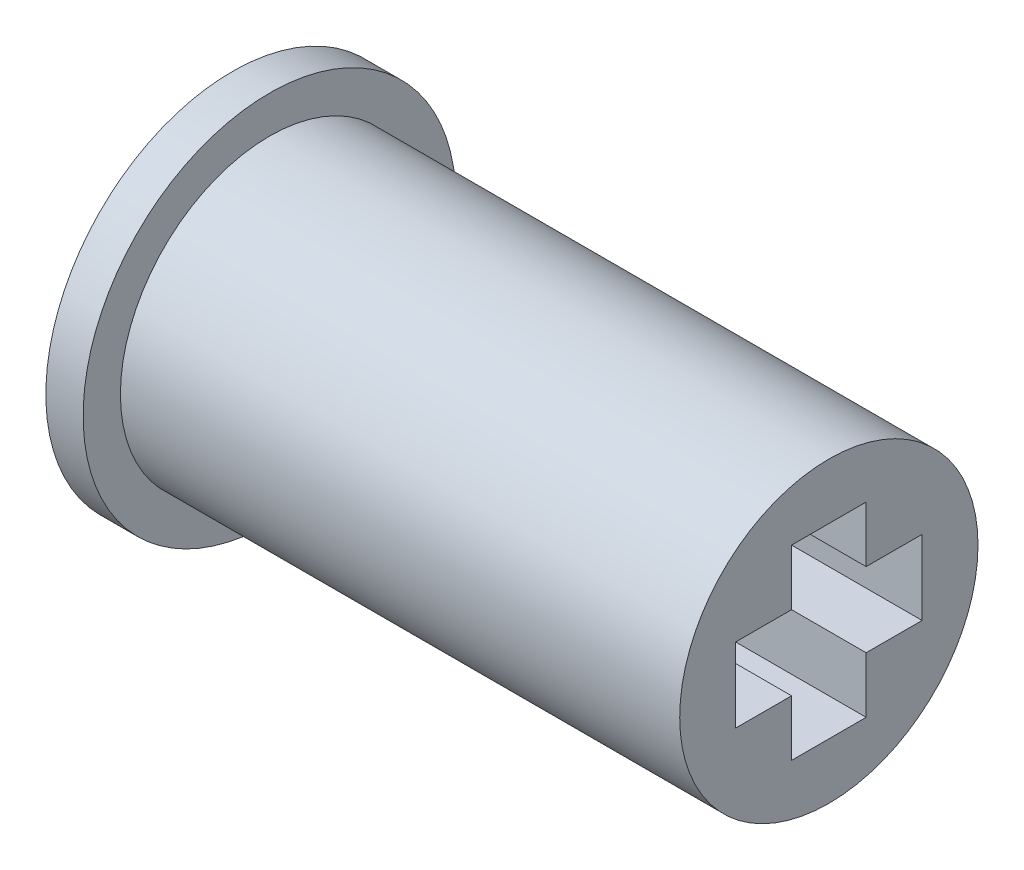
ISO-10303-21;
HEADER;
FILE_DESCRIPTION(('STEP AP214'),'2;1');
FILE_NAME('part.step','',(''),(''),'','','');
FILE_SCHEMA(('AUTOMOTIVE_DESIGN { 1 0 10303 214 1 1 1 1 }'));
ENDSEC;
DATA;
#1=APPLICATION_CONTEXT('core data for automotive mechanical design processes');
#2=APPLICATION_PROTOCOL_DEFINITION('international standard','automotive_design',2000,#1);
#3=PRODUCT_CONTEXT('',#1,'mechanical');
#4=PRODUCT('Part','Part','',(#3));
#5=PRODUCT_RELATED_PRODUCT_CATEGORY('part','',(#4));
#6=PRODUCT_DEFINITION_FORMATION('','',#4);
#7=PRODUCT_DEFINITION_CONTEXT('part definition',#1,'design');
#8=PRODUCT_DEFINITION('design','',#6,#7);
#9=PRODUCT_DEFINITION_SHAPE('','',#8);
#10=(LENGTH_UNIT() NAMED_UNIT(*) SI_UNIT(.MILLI.,.METRE.));
#11=(NAMED_UNIT(*) PLANE_ANGLE_UNIT() SI_UNIT($,.RADIAN.));
#12=(NAMED_UNIT(*) SI_UNIT($,.STERADIAN.) SOLID_ANGLE_UNIT());
#13=UNCERTAINTY_MEASURE_WITH_UNIT(LENGTH_MEASURE(1.E-05),#10,'distance_accuracy_value','');
#14=(GEOMETRIC_REPRESENTATION_CONTEXT(3) GLOBAL_UNCERTAINTY_ASSIGNED_CONTEXT((#13)) GLOBAL_UNIT_ASSIGNED_CONTEXT((#10,
#11,#12)) REPRESENTATION_CONTEXT('',''));
#15=CARTESIAN_POINT('',(0.,0.,0.));
#16=DIRECTION('',(0.,0.,1.));
#17=DIRECTION('',(1.,0.,0.));
#18=AXIS2_PLACEMENT_3D('',#15,#16,#17);
#19=CARTESIAN_POINT('',(16.,0.,0.));
#20=DIRECTION('',(1.,0.,0.));
#21=DIRECTION('',(0.,0.,-1.));
#22=AXIS2_PLACEMENT_3D('',#19,#20,#21);
#23=PLANE('',#22);
#24=CARTESIAN_POINT('',(16.,0.,0.));
#25=DIRECTION('',(1.,0.,0.));
#26=DIRECTION('',(0.,0.,-1.));
#27=AXIS2_PLACEMENT_3D('',#24,#25,#26);
#28=CIRCLE('',#27,4.);
#29=CARTESIAN_POINT('',(16.,0.,-4.));
#30=VERTEX_POINT('',#29);
#31=EDGE_CURVE('E190',#30,#30,#28,.T.);
#32=ORIENTED_EDGE('',*,*,#31,.T.);
#33=EDGE_LOOP('',(#32));
#34=FACE_BOUND('',#33,.T.);
#35=DIRECTION('',(0.,0.,1.));
#36=VECTOR('',#35,1.);
#37=CARTESIAN_POINT('',(16.,1.,0.));
#38=LINE('',#37,#36);
#39=CARTESIAN_POINT('',(16.,0.999999999999999,1.));
#40=VERTEX_POINT('',#39);
#41=CARTESIAN_POINT('',(16.,0.999999999999999,2.5));
#42=VERTEX_POINT('',#41);
#43=EDGE_CURVE('E159',#40,#42,#38,.T.);
#44=ORIENTED_EDGE('',*,*,#43,.F.);
#45=DIRECTION('',(0.,1.,0.));
#46=VECTOR('',#45,1.);
#47=CARTESIAN_POINT('',(16.,0.,1.));
#48=LINE('',#47,#46);
#49=CARTESIAN_POINT('',(16.,2.5,1.));
#50=VERTEX_POINT('',#49);
#51=EDGE_CURVE('E52',#40,#50,#48,.T.);
#52=ORIENTED_EDGE('',*,*,#51,.T.);
#53=DIRECTION('',(0.,0.,-1.));
#54=VECTOR('',#53,1.);
#55=CARTESIAN_POINT('',(16.,2.5,0.));
#56=LINE('',#55,#54);
#57=CARTESIAN_POINT('',(16.,2.5,-1.));
#58=VERTEX_POINT('',#57);
#59=EDGE_CURVE('E102',#50,#58,#56,.T.);
#60=ORIENTED_EDGE('',*,*,#59,.T.);
#61=DIRECTION('',(0.,1.,0.));
#62=VECTOR('',#61,1.);
#63=CARTESIAN_POINT('',(16.,0.,-1.));
#64=LINE('',#63,#62);
#65=CARTESIAN_POINT('',(16.,1.,-1.));
#66=VERTEX_POINT('',#65);
#67=EDGE_CURVE('E184',#66,#58,#64,.T.);
#68=ORIENTED_EDGE('',*,*,#67,.F.);
#69=DIRECTION('',(0.,0.,-1.));
#70=VECTOR('',#69,1.);
#71=CARTESIAN_POINT('',(16.,1.,0.));
#72=LINE('',#71,#70);
#73=CARTESIAN_POINT('',(16.,1.,-2.5));
#74=VERTEX_POINT('',#73);
#75=EDGE_CURVE('E138',#66,#74,#72,.T.);
#76=ORIENTED_EDGE('',*,*,#75,.T.);
#77=DIRECTION('',(0.,-1.,0.));
#78=VECTOR('',#77,1.);
#79=CARTESIAN_POINT('',(16.,0.,-2.5));
#80=LINE('',#79,#78);
#81=CARTESIAN_POINT('',(16.,-1.,-2.5));
#82=VERTEX_POINT('',#81);
#83=EDGE_CURVE('E180',#74,#82,#80,.T.);
#84=ORIENTED_EDGE('',*,*,#83,.T.);
#85=DIRECTION('',(0.,0.,-1.));
#86=VECTOR('',#85,1.);
#87=CARTESIAN_POINT('',(16.,-1.,0.));
#88=LINE('',#87,#86);
#89=CARTESIAN_POINT('',(16.,-1.,-1.));
#90=VERTEX_POINT('',#89);
#91=EDGE_CURVE('E177',#90,#82,#88,.T.);
#92=ORIENTED_EDGE('',*,*,#91,.F.);
#93=DIRECTION('',(0.,-1.,0.));
#94=VECTOR('',#93,1.);
#95=CARTESIAN_POINT('',(16.,0.,-1.));
#96=LINE('',#95,#94);
#97=CARTESIAN_POINT('',(16.,-2.5,-1.));
#98=VERTEX_POINT('',#97);
#99=EDGE_CURVE('E174',#90,#98,#96,.T.);
#100=ORIENTED_EDGE('',*,*,#99,.T.);
#101=DIRECTION('',(0.,0.,1.));
#102=VECTOR('',#101,1.);
#103=CARTESIAN_POINT('',(16.,-2.5,0.));
#104=LINE('',#103,#102);
#105=CARTESIAN_POINT('',(16.,-2.5,1.));
#106=VERTEX_POINT('',#105);
#107=EDGE_CURVE('E171',#98,#106,#104,.T.);
#108=ORIENTED_EDGE('',*,*,#107,.T.);
#109=DIRECTION('',(0.,-1.,0.));
#110=VECTOR('',#109,1.);
#111=CARTESIAN_POINT('',(16.,0.,1.));
#112=LINE('',#111,#110);
#113=CARTESIAN_POINT('',(16.,-1.,1.));
#114=VERTEX_POINT('',#113);
#115=EDGE_CURVE('E168',#114,#106,#112,.T.);
#116=ORIENTED_EDGE('',*,*,#115,.F.);
#117=DIRECTION('',(0.,0.,1.));
#118=VECTOR('',#117,1.);
#119=CARTESIAN_POINT('',(16.,-1.,0.));
#120=LINE('',#119,#118);
#121=CARTESIAN_POINT('',(16.,-1.,2.5));
#122=VERTEX_POINT('',#121);
#123=EDGE_CURVE('E165',#114,#122,#120,.T.);
#124=ORIENTED_EDGE('',*,*,#123,.T.);
#125=DIRECTION('',(0.,1.,0.));
#126=VECTOR('',#125,1.);
#127=CARTESIAN_POINT('',(16.,0.,2.5));
#128=LINE('',#127,#126);
#129=EDGE_CURVE('E162',#122,#42,#128,.T.);
#130=ORIENTED_EDGE('',*,*,#129,.T.);
#131=EDGE_LOOP('',(#44,#52,#60,#68,#76,#84,#92,#100,#108,#116,#124,#130));
#132=FACE_BOUND('',#131,.T.);
#133=ADVANCED_FACE('F35',(#34,#132),#23,.T.);
#134=CARTESIAN_POINT('',(1.,0.,0.));
#135=DIRECTION('',(-1.,0.,0.));
#136=DIRECTION('',(0.,0.,1.));
#137=AXIS2_PLACEMENT_3D('',#134,#135,#136);
#138=CYLINDRICAL_SURFACE('',#137,5.);
#139=CARTESIAN_POINT('',(1.,0.,0.));
#140=DIRECTION('',(1.,0.,0.));
#141=DIRECTION('',(0.,0.,-1.));
#142=AXIS2_PLACEMENT_3D('',#139,#140,#141);
#143=CIRCLE('',#142,5.);
#144=CARTESIAN_POINT('',(1.,0.,-5.));
#145=VERTEX_POINT('',#144);
#146=EDGE_CURVE('E44',#145,#145,#143,.T.);
#147=ORIENTED_EDGE('',*,*,#146,.F.);
#148=EDGE_LOOP('',(#147));
#149=FACE_BOUND('',#148,.T.);
#150=CARTESIAN_POINT('',(0.,0.,0.));
#151=DIRECTION('',(1.,0.,0.));
#152=DIRECTION('',(0.,0.,-1.));
#153=AXIS2_PLACEMENT_3D('',#150,#151,#152);
#154=CIRCLE('',#153,5.);
#155=CARTESIAN_POINT('',(0.,0.,-5.));
#156=VERTEX_POINT('',#155);
#157=EDGE_CURVE('E39',#156,#156,#154,.T.);
#158=ORIENTED_EDGE('',*,*,#157,.T.);
#159=EDGE_LOOP('',(#158));
#160=FACE_BOUND('',#159,.T.);
#161=ADVANCED_FACE('F37',(#149,#160),#138,.T.);
#162=CARTESIAN_POINT('',(1.,0.,0.));
#163=DIRECTION('',(1.,0.,0.));
#164=DIRECTION('',(0.,0.,-1.));
#165=AXIS2_PLACEMENT_3D('',#162,#163,#164);
#166=PLANE('',#165);
#167=CARTESIAN_POINT('',(1.,0.,0.));
#168=DIRECTION('',(1.,0.,0.));
#169=DIRECTION('',(0.,0.,-1.));
#170=AXIS2_PLACEMENT_3D('',#167,#168,#169);
#171=CIRCLE('',#170,4.);
#172=CARTESIAN_POINT('',(1.,0.,-4.));
#173=VERTEX_POINT('',#172);
#174=EDGE_CURVE('E11',#173,#173,#171,.T.);
#175=ORIENTED_EDGE('',*,*,#174,.F.);
#176=EDGE_LOOP('',(#175));
#177=FACE_BOUND('',#176,.T.);
#178=ORIENTED_EDGE('',*,*,#146,.T.);
#179=EDGE_LOOP('',(#178));
#180=FACE_BOUND('',#179,.T.);
#181=ADVANCED_FACE('F219',(#177,#180),#166,.T.);
#182=CARTESIAN_POINT('',(0.,0.,0.));
#183=DIRECTION('',(1.,0.,0.));
#184=DIRECTION('',(0.,0.,-1.));
#185=AXIS2_PLACEMENT_3D('',#182,#183,#184);
#186=PLANE('',#185);
#187=ORIENTED_EDGE('',*,*,#157,.F.);
#188=EDGE_LOOP('',(#187));
#189=FACE_BOUND('',#188,.T.);
#190=ADVANCED_FACE('F216',(#189),#186,.F.);
#191=CARTESIAN_POINT('',(16.,0.,0.));
#192=DIRECTION('',(-1.,0.,0.));
#193=DIRECTION('',(0.,0.,1.));
#194=AXIS2_PLACEMENT_3D('',#191,#192,#193);
#195=CYLINDRICAL_SURFACE('',#194,4.);
#196=ORIENTED_EDGE('',*,*,#31,.F.);
#197=EDGE_LOOP('',(#196));
#198=FACE_BOUND('',#197,.T.);
#199=ORIENTED_EDGE('',*,*,#174,.T.);
#200=EDGE_LOOP('',(#199));
#201=FACE_BOUND('',#200,.T.);
#202=ADVANCED_FACE('F218',(#198,#201),#195,.T.);
#203=CARTESIAN_POINT('',(1.,0.,1.));
#204=DIRECTION('',(0.,0.,-1.));
#205=DIRECTION('',(-1.,0.,0.));
#206=AXIS2_PLACEMENT_3D('',#203,#204,#205);
#207=PLANE('',#206);
#208=ORIENTED_EDGE('',*,*,#51,.F.);
#209=DIRECTION('',(1.,0.,0.));
#210=VECTOR('',#209,1.);
#211=CARTESIAN_POINT('',(1.,1.,1.));
#212=LINE('',#211,#210);
#213=CARTESIAN_POINT('',(1.,1.,1.));
#214=VERTEX_POINT('',#213);
#215=EDGE_CURVE('E105',#214,#40,#212,.T.);
#216=ORIENTED_EDGE('',*,*,#215,.F.);
#217=DIRECTION('',(0.,1.,0.));
#218=VECTOR('',#217,1.);
#219=CARTESIAN_POINT('',(1.,0.,1.));
#220=LINE('',#219,#218);
#221=CARTESIAN_POINT('',(1.,2.5,1.));
#222=VERTEX_POINT('',#221);
#223=EDGE_CURVE('E187',#214,#222,#220,.T.);
#224=ORIENTED_EDGE('',*,*,#223,.T.);
#225=DIRECTION('',(1.,0.,0.));
#226=VECTOR('',#225,1.);
#227=CARTESIAN_POINT('',(1.,2.5,1.));
#228=LINE('',#227,#226);
#229=EDGE_CURVE('E188',#222,#50,#228,.T.);
#230=ORIENTED_EDGE('',*,*,#229,.T.);
#231=EDGE_LOOP('',(#208,#216,#224,#230));
#232=FACE_BOUND('',#231,.T.);
#233=ADVANCED_FACE('F224',(#232),#207,.T.);
#234=CARTESIAN_POINT('',(1.,2.5,0.));
#235=DIRECTION('',(0.,-1.,0.));
#236=DIRECTION('',(0.,0.,-1.));
#237=AXIS2_PLACEMENT_3D('',#234,#235,#236);
#238=PLANE('',#237);
#239=ORIENTED_EDGE('',*,*,#59,.F.);
#240=ORIENTED_EDGE('',*,*,#229,.F.);
#241=DIRECTION('',(0.,0.,-1.));
#242=VECTOR('',#241,1.);
#243=CARTESIAN_POINT('',(1.,2.5,0.));
#244=LINE('',#243,#242);
#245=CARTESIAN_POINT('',(1.,2.5,-1.));
#246=VERTEX_POINT('',#245);
#247=EDGE_CURVE('E61',#222,#246,#244,.T.);
#248=ORIENTED_EDGE('',*,*,#247,.T.);
#249=DIRECTION('',(1.,0.,0.));
#250=VECTOR('',#249,1.);
#251=CARTESIAN_POINT('',(1.,2.5,-1.));
#252=LINE('',#251,#250);
#253=EDGE_CURVE('E143',#246,#58,#252,.T.);
#254=ORIENTED_EDGE('',*,*,#253,.T.);
#255=EDGE_LOOP('',(#239,#240,#248,#254));
#256=FACE_BOUND('',#255,.T.);
#257=ADVANCED_FACE('F240',(#256),#238,.T.);
#258=CARTESIAN_POINT('',(1.,0.,-1.));
#259=DIRECTION('',(0.,0.,-1.));
#260=DIRECTION('',(0.,1.,0.));
#261=AXIS2_PLACEMENT_3D('',#258,#259,#260);
#262=PLANE('',#261);
#263=ORIENTED_EDGE('',*,*,#67,.T.);
#264=ORIENTED_EDGE('',*,*,#253,.F.);
#265=DIRECTION('',(0.,1.,0.));
#266=VECTOR('',#265,1.);
#267=CARTESIAN_POINT('',(1.,0.,-1.));
#268=LINE('',#267,#266);
#269=CARTESIAN_POINT('',(1.,1.,-1.));
#270=VERTEX_POINT('',#269);
#271=EDGE_CURVE('E148',#270,#246,#268,.T.);
#272=ORIENTED_EDGE('',*,*,#271,.F.);
#273=DIRECTION('',(1.,0.,0.));
#274=VECTOR('',#273,1.);
#275=CARTESIAN_POINT('',(1.,1.,-1.));
#276=LINE('',#275,#274);
#277=EDGE_CURVE('E132',#270,#66,#276,.T.);
#278=ORIENTED_EDGE('',*,*,#277,.T.);
#279=EDGE_LOOP('',(#263,#264,#272,#278));
#280=FACE_BOUND('',#279,.T.);
#281=ADVANCED_FACE('F153',(#280),#262,.F.);
#282=CARTESIAN_POINT('',(1.,1.,0.));
#283=DIRECTION('',(0.,-1.,0.));
#284=DIRECTION('',(0.,0.,-1.));
#285=AXIS2_PLACEMENT_3D('',#282,#283,#284);
#286=PLANE('',#285);
#287=ORIENTED_EDGE('',*,*,#75,.F.);
#288=ORIENTED_EDGE('',*,*,#277,.F.);
#289=DIRECTION('',(0.,0.,-1.));
#290=VECTOR('',#289,1.);
#291=CARTESIAN_POINT('',(1.,1.,0.));
#292=LINE('',#291,#290);
#293=CARTESIAN_POINT('',(1.,1.,-2.5));
#294=VERTEX_POINT('',#293);
#295=EDGE_CURVE('E135',#270,#294,#292,.T.);
#296=ORIENTED_EDGE('',*,*,#295,.T.);
#297=DIRECTION('',(1.,0.,0.));
#298=VECTOR('',#297,1.);
#299=CARTESIAN_POINT('',(1.,1.,-2.5));
#300=LINE('',#299,#298);
#301=EDGE_CURVE('E144',#294,#74,#300,.T.);
#302=ORIENTED_EDGE('',*,*,#301,.T.);
#303=EDGE_LOOP('',(#287,#288,#296,#302));
#304=FACE_BOUND('',#303,.T.);
#305=ADVANCED_FACE('F134',(#304),#286,.T.);
#306=CARTESIAN_POINT('',(1.,0.,-2.5));
#307=DIRECTION('',(0.,0.,1.));
#308=DIRECTION('',(0.,-1.,0.));
#309=AXIS2_PLACEMENT_3D('',#306,#307,#308);
#310=PLANE('',#309);
#311=ORIENTED_EDGE('',*,*,#83,.F.);
#312=ORIENTED_EDGE('',*,*,#301,.F.);
#313=DIRECTION('',(0.,-1.,0.));
#314=VECTOR('',#313,1.);
#315=CARTESIAN_POINT('',(1.,0.,-2.5));
#316=LINE('',#315,#314);
#317=CARTESIAN_POINT('',(1.,-1.,-2.5));
#318=VERTEX_POINT('',#317);
#319=EDGE_CURVE('E150',#294,#318,#316,.T.);
#320=ORIENTED_EDGE('',*,*,#319,.T.);
#321=DIRECTION('',(1.,0.,0.));
#322=VECTOR('',#321,1.);
#323=CARTESIAN_POINT('',(1.,-1.,-2.5));
#324=LINE('',#323,#322);
#325=EDGE_CURVE('E193',#318,#82,#324,.T.);
#326=ORIENTED_EDGE('',*,*,#325,.T.);
#327=EDGE_LOOP('',(#311,#312,#320,#326));
#328=FACE_BOUND('',#327,.T.);
#329=ADVANCED_FACE('F268',(#328),#310,.T.);
#330=CARTESIAN_POINT('',(1.,-1.,0.));
#331=DIRECTION('',(0.,-1.,0.));
#332=DIRECTION('',(0.,0.,-1.));
#333=AXIS2_PLACEMENT_3D('',#330,#331,#332);
#334=PLANE('',#333);
#335=ORIENTED_EDGE('',*,*,#91,.T.);
#336=ORIENTED_EDGE('',*,*,#325,.F.);
#337=DIRECTION('',(0.,0.,-1.));
#338=VECTOR('',#337,1.);
#339=CARTESIAN_POINT('',(1.,-1.,0.));
#340=LINE('',#339,#338);
#341=CARTESIAN_POINT('',(1.,-1.,-1.));
#342=VERTEX_POINT('',#341);
#343=EDGE_CURVE('E429',#342,#318,#340,.T.);
#344=ORIENTED_EDGE('',*,*,#343,.F.);
#345=DIRECTION('',(1.,0.,0.));
#346=VECTOR('',#345,1.);
#347=CARTESIAN_POINT('',(1.,-1.,-1.));
#348=LINE('',#347,#346);
#349=EDGE_CURVE('E195',#342,#90,#348,.T.);
#350=ORIENTED_EDGE('',*,*,#349,.T.);
#351=EDGE_LOOP('',(#335,#336,#344,#350));
#352=FACE_BOUND('',#351,.T.);
#353=ADVANCED_FACE('F264',(#352),#334,.F.);
#354=CARTESIAN_POINT('',(1.,0.,-1.));
#355=DIRECTION('',(0.,0.,1.));
#356=DIRECTION('',(0.,-1.,0.));
#357=AXIS2_PLACEMENT_3D('',#354,#355,#356);
#358=PLANE('',#357);
#359=ORIENTED_EDGE('',*,*,#99,.F.);
#360=ORIENTED_EDGE('',*,*,#349,.F.);
#361=DIRECTION('',(0.,-1.,0.));
#362=VECTOR('',#361,1.);
#363=CARTESIAN_POINT('',(1.,0.,-1.));
#364=LINE('',#363,#362);
#365=CARTESIAN_POINT('',(1.,-2.5,-1.));
#366=VERTEX_POINT('',#365);
#367=EDGE_CURVE('E427',#342,#366,#364,.T.);
#368=ORIENTED_EDGE('',*,*,#367,.T.);
#369=DIRECTION('',(1.,0.,0.));
#370=VECTOR('',#369,1.);
#371=CARTESIAN_POINT('',(1.,-2.5,-1.));
#372=LINE('',#371,#370);
#373=EDGE_CURVE('E197',#366,#98,#372,.T.);
#374=ORIENTED_EDGE('',*,*,#373,.T.);
#375=EDGE_LOOP('',(#359,#360,#368,#374));
#376=FACE_BOUND('',#375,.T.);
#377=ADVANCED_FACE('F260',(#376),#358,.T.);
#378=CARTESIAN_POINT('',(1.,-2.5,0.));
#379=DIRECTION('',(0.,1.,0.));
#380=DIRECTION('',(0.,0.,1.));
#381=AXIS2_PLACEMENT_3D('',#378,#379,#380);
#382=PLANE('',#381);
#383=ORIENTED_EDGE('',*,*,#107,.F.);
#384=ORIENTED_EDGE('',*,*,#373,.F.);
#385=DIRECTION('',(0.,0.,1.));
#386=VECTOR('',#385,1.);
#387=CARTESIAN_POINT('',(1.,-2.5,0.));
#388=LINE('',#387,#386);
#389=CARTESIAN_POINT('',(1.,-2.5,1.));
#390=VERTEX_POINT('',#389);
#391=EDGE_CURVE('E425',#366,#390,#388,.T.);
#392=ORIENTED_EDGE('',*,*,#391,.T.);
#393=DIRECTION('',(1.,0.,0.));
#394=VECTOR('',#393,1.);
#395=CARTESIAN_POINT('',(1.,-2.5,1.));
#396=LINE('',#395,#394);
#397=EDGE_CURVE('E199',#390,#106,#396,.T.);
#398=ORIENTED_EDGE('',*,*,#397,.T.);
#399=EDGE_LOOP('',(#383,#384,#392,#398));
#400=FACE_BOUND('',#399,.T.);
#401=ADVANCED_FACE('F256',(#400),#382,.T.);
#402=CARTESIAN_POINT('',(1.,0.,1.));
#403=DIRECTION('',(0.,0.,1.));
#404=DIRECTION('',(0.,-1.,0.));
#405=AXIS2_PLACEMENT_3D('',#402,#403,#404);
#406=PLANE('',#405);
#407=ORIENTED_EDGE('',*,*,#115,.T.);
#408=ORIENTED_EDGE('',*,*,#397,.F.);
#409=DIRECTION('',(0.,-1.,0.));
#410=VECTOR('',#409,1.);
#411=CARTESIAN_POINT('',(1.,0.,1.));
#412=LINE('',#411,#410);
#413=CARTESIAN_POINT('',(1.,-1.,1.));
#414=VERTEX_POINT('',#413);
#415=EDGE_CURVE('E422',#414,#390,#412,.T.);
#416=ORIENTED_EDGE('',*,*,#415,.F.);
#417=DIRECTION('',(1.,0.,0.));
#418=VECTOR('',#417,1.);
#419=CARTESIAN_POINT('',(1.,-1.,1.));
#420=LINE('',#419,#418);
#421=EDGE_CURVE('E201',#414,#114,#420,.T.);
#422=ORIENTED_EDGE('',*,*,#421,.T.);
#423=EDGE_LOOP('',(#407,#408,#416,#422));
#424=FACE_BOUND('',#423,.T.);
#425=ADVANCED_FACE('F252',(#424),#406,.F.);
#426=CARTESIAN_POINT('',(1.,-1.,0.));
#427=DIRECTION('',(0.,1.,0.));
#428=DIRECTION('',(0.,0.,1.));
#429=AXIS2_PLACEMENT_3D('',#426,#427,#428);
#430=PLANE('',#429);
#431=ORIENTED_EDGE('',*,*,#123,.F.);
#432=ORIENTED_EDGE('',*,*,#421,.F.);
#433=DIRECTION('',(0.,0.,1.));
#434=VECTOR('',#433,1.);
#435=CARTESIAN_POINT('',(1.,-1.,0.));
#436=LINE('',#435,#434);
#437=CARTESIAN_POINT('',(1.,-1.,2.5));
#438=VERTEX_POINT('',#437);
#439=EDGE_CURVE('E417',#414,#438,#436,.T.);
#440=ORIENTED_EDGE('',*,*,#439,.T.);
#441=DIRECTION('',(1.,0.,0.));
#442=VECTOR('',#441,1.);
#443=CARTESIAN_POINT('',(1.,-1.,2.5));
#444=LINE('',#443,#442);
#445=EDGE_CURVE('E203',#438,#122,#444,.T.);
#446=ORIENTED_EDGE('',*,*,#445,.T.);
#447=EDGE_LOOP('',(#431,#432,#440,#446));
#448=FACE_BOUND('',#447,.T.);
#449=ADVANCED_FACE('F248',(#448),#430,.T.);
#450=CARTESIAN_POINT('',(1.,0.,2.5));
#451=DIRECTION('',(0.,0.,-1.));
#452=DIRECTION('',(-1.,0.,0.));
#453=AXIS2_PLACEMENT_3D('',#450,#451,#452);
#454=PLANE('',#453);
#455=ORIENTED_EDGE('',*,*,#129,.F.);
#456=ORIENTED_EDGE('',*,*,#445,.F.);
#457=DIRECTION('',(0.,1.,0.));
#458=VECTOR('',#457,1.);
#459=CARTESIAN_POINT('',(1.,0.,2.5));
#460=LINE('',#459,#458);
#461=CARTESIAN_POINT('',(1.,0.999999999999999,2.5));
#462=VERTEX_POINT('',#461);
#463=EDGE_CURVE('E415',#438,#462,#460,.T.);
#464=ORIENTED_EDGE('',*,*,#463,.T.);
#465=DIRECTION('',(1.,0.,0.));
#466=VECTOR('',#465,1.);
#467=CARTESIAN_POINT('',(1.,0.999999999999999,2.5));
#468=LINE('',#467,#466);
#469=EDGE_CURVE('E205',#462,#42,#468,.T.);
#470=ORIENTED_EDGE('',*,*,#469,.T.);
#471=EDGE_LOOP('',(#455,#456,#464,#470));
#472=FACE_BOUND('',#471,.T.);
#473=ADVANCED_FACE('F244',(#472),#454,.T.);
#474=CARTESIAN_POINT('',(1.,1.,0.));
#475=DIRECTION('',(0.,1.,0.));
#476=DIRECTION('',(0.,0.,1.));
#477=AXIS2_PLACEMENT_3D('',#474,#475,#476);
#478=PLANE('',#477);
#479=ORIENTED_EDGE('',*,*,#43,.T.);
#480=ORIENTED_EDGE('',*,*,#469,.F.);
#481=DIRECTION('',(0.,0.,1.));
#482=VECTOR('',#481,1.);
#483=CARTESIAN_POINT('',(1.,1.,0.));
#484=LINE('',#483,#482);
#485=EDGE_CURVE('E413',#214,#462,#484,.T.);
#486=ORIENTED_EDGE('',*,*,#485,.F.);
#487=ORIENTED_EDGE('',*,*,#215,.T.);
#488=EDGE_LOOP('',(#479,#480,#486,#487));
#489=FACE_BOUND('',#488,.T.);
#490=ADVANCED_FACE('F241',(#489),#478,.F.);
#491=CARTESIAN_POINT('',(1.,0.,0.));
#492=DIRECTION('',(1.,0.,0.));
#493=DIRECTION('',(0.,0.,-1.));
#494=AXIS2_PLACEMENT_3D('',#491,#492,#493);
#495=PLANE('',#494);
#496=ORIENTED_EDGE('',*,*,#223,.F.);
#497=ORIENTED_EDGE('',*,*,#485,.T.);
#498=ORIENTED_EDGE('',*,*,#463,.F.);
#499=ORIENTED_EDGE('',*,*,#439,.F.);
#500=ORIENTED_EDGE('',*,*,#415,.T.);
#501=ORIENTED_EDGE('',*,*,#391,.F.);
#502=ORIENTED_EDGE('',*,*,#367,.F.);
#503=ORIENTED_EDGE('',*,*,#343,.T.);
#504=ORIENTED_EDGE('',*,*,#319,.F.);
#505=ORIENTED_EDGE('',*,*,#295,.F.);
#506=ORIENTED_EDGE('',*,*,#271,.T.);
#507=ORIENTED_EDGE('',*,*,#247,.F.);
#508=EDGE_LOOP('',(#496,#497,#498,#499,#500,#501,#502,#503,#504,#505,#506,#507));
#509=FACE_BOUND('',#508,.T.);
#510=ADVANCED_FACE('F147',(#509),#495,.T.);
#511=CLOSED_SHELL('',(#133,#161,#181,#190,#202,#233,#257,#281,#305,#329,#353,#377,#401,#425,
#449,#473,#490,#510));
#512=MANIFOLD_SOLID_BREP('B2',#511);
#513=ADVANCED_BREP_SHAPE_REPRESENTATION('',(#18,#512),#14);
#514=SHAPE_DEFINITION_REPRESENTATION(#9,#513);
ENDSEC;
END-ISO-10303-21;
